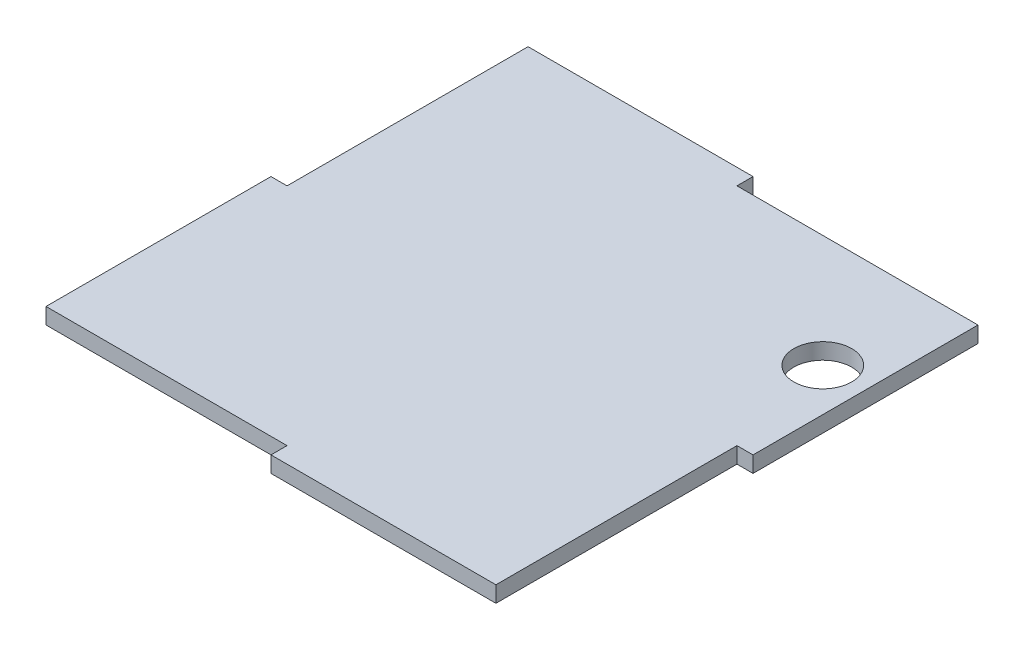
ISO-10303-21;
HEADER;
FILE_DESCRIPTION(('STEP AP214'),'2;1');
FILE_NAME('part.step','',(''),(''),'','','');
FILE_SCHEMA(('AUTOMOTIVE_DESIGN { 1 0 10303 214 1 1 1 1 }'));
ENDSEC;
DATA;
#1=APPLICATION_CONTEXT('core data for automotive mechanical design processes');
#2=APPLICATION_PROTOCOL_DEFINITION('international standard','automotive_design',2000,#1);
#3=PRODUCT_CONTEXT('',#1,'mechanical');
#4=PRODUCT('Part','Part','',(#3));
#5=PRODUCT_RELATED_PRODUCT_CATEGORY('part','',(#4));
#6=PRODUCT_DEFINITION_FORMATION('','',#4);
#7=PRODUCT_DEFINITION_CONTEXT('part definition',#1,'design');
#8=PRODUCT_DEFINITION('design','',#6,#7);
#9=PRODUCT_DEFINITION_SHAPE('','',#8);
#10=(LENGTH_UNIT() NAMED_UNIT(*) SI_UNIT(.MILLI.,.METRE.));
#11=(NAMED_UNIT(*) PLANE_ANGLE_UNIT() SI_UNIT($,.RADIAN.));
#12=(NAMED_UNIT(*) SI_UNIT($,.STERADIAN.) SOLID_ANGLE_UNIT());
#13=UNCERTAINTY_MEASURE_WITH_UNIT(LENGTH_MEASURE(1.E-05),#10,'distance_accuracy_value','');
#14=(GEOMETRIC_REPRESENTATION_CONTEXT(3) GLOBAL_UNCERTAINTY_ASSIGNED_CONTEXT((#13)) GLOBAL_UNIT_ASSIGNED_CONTEXT((#10,
#11,#12)) REPRESENTATION_CONTEXT('',''));
#15=CARTESIAN_POINT('',(0.,0.,0.));
#16=DIRECTION('',(0.,0.,1.));
#17=DIRECTION('',(1.,0.,0.));
#18=AXIS2_PLACEMENT_3D('',#15,#16,#17);
#19=CARTESIAN_POINT('',(0.,6.35,-4.5401216046462));
#20=DIRECTION('',(0.,0.,-1.));
#21=DIRECTION('',(-1.,0.,0.));
#22=AXIS2_PLACEMENT_3D('',#19,#20,#21);
#23=PLANE('',#22);
#24=DIRECTION('',(1.,0.,0.));
#25=VECTOR('',#24,1.);
#26=CARTESIAN_POINT('',(0.,0.,-4.5401216046462));
#27=LINE('',#26,#25);
#28=CARTESIAN_POINT('',(-118.856214689266,0.,-4.54012160464622));
#29=VERTEX_POINT('',#28);
#30=CARTESIAN_POINT('',(-112.506214689266,0.,-4.54012160464622));
#31=VERTEX_POINT('',#30);
#32=EDGE_CURVE('E158',#29,#31,#27,.T.);
#33=ORIENTED_EDGE('',*,*,#32,.F.);
#34=DIRECTION('',(0.,-1.,0.));
#35=VECTOR('',#34,1.);
#36=CARTESIAN_POINT('',(-118.856214689266,6.35,-4.54012160464622));
#37=LINE('',#36,#35);
#38=CARTESIAN_POINT('',(-118.856214689266,6.35,-4.54012160464622));
#39=VERTEX_POINT('',#38);
#40=EDGE_CURVE('E11',#39,#29,#37,.T.);
#41=ORIENTED_EDGE('',*,*,#40,.F.);
#42=DIRECTION('',(1.,0.,0.));
#43=VECTOR('',#42,1.);
#44=CARTESIAN_POINT('',(0.,6.35,-4.5401216046462));
#45=LINE('',#44,#43);
#46=CARTESIAN_POINT('',(-112.506214689266,6.35,-4.54012160464622));
#47=VERTEX_POINT('',#46);
#48=EDGE_CURVE('E231',#39,#47,#45,.T.);
#49=ORIENTED_EDGE('',*,*,#48,.T.);
#50=DIRECTION('',(0.,-1.,0.));
#51=VECTOR('',#50,1.);
#52=CARTESIAN_POINT('',(-112.506214689266,6.35,-4.54012160464622));
#53=LINE('',#52,#51);
#54=EDGE_CURVE('E100',#47,#31,#53,.T.);
#55=ORIENTED_EDGE('',*,*,#54,.T.);
#56=EDGE_LOOP('',(#33,#41,#49,#55));
#57=FACE_BOUND('',#56,.T.);
#58=ADVANCED_FACE('F37',(#57),#23,.T.);
#59=CARTESIAN_POINT('',(-118.856214689266,6.35,0.));
#60=DIRECTION('',(-1.,0.,0.));
#61=DIRECTION('',(0.,0.,1.));
#62=AXIS2_PLACEMENT_3D('',#59,#60,#61);
#63=PLANE('',#62);
#64=DIRECTION('',(0.,0.,-1.));
#65=VECTOR('',#64,1.);
#66=CARTESIAN_POINT('',(-118.856214689266,0.,0.));
#67=LINE('',#66,#65);
#68=CARTESIAN_POINT('',(-118.856214689266,0.,84.3598783953538));
#69=VERTEX_POINT('',#68);
#70=EDGE_CURVE('E161',#69,#29,#67,.T.);
#71=ORIENTED_EDGE('',*,*,#70,.F.);
#72=DIRECTION('',(0.,-1.,0.));
#73=VECTOR('',#72,1.);
#74=CARTESIAN_POINT('',(-118.856214689266,6.35,84.3598783953538));
#75=LINE('',#74,#73);
#76=CARTESIAN_POINT('',(-118.856214689266,6.35,84.3598783953538));
#77=VERTEX_POINT('',#76);
#78=EDGE_CURVE('E46',#77,#69,#75,.T.);
#79=ORIENTED_EDGE('',*,*,#78,.F.);
#80=DIRECTION('',(0.,0.,-1.));
#81=VECTOR('',#80,1.);
#82=CARTESIAN_POINT('',(-118.856214689266,6.35,0.));
#83=LINE('',#82,#81);
#84=EDGE_CURVE('E227',#77,#39,#83,.T.);
#85=ORIENTED_EDGE('',*,*,#84,.T.);
#86=ORIENTED_EDGE('',*,*,#40,.T.);
#87=EDGE_LOOP('',(#71,#79,#85,#86));
#88=FACE_BOUND('',#87,.T.);
#89=ADVANCED_FACE('F215',(#88),#63,.T.);
#90=CARTESIAN_POINT('',(0.,6.35,84.3598783953538));
#91=DIRECTION('',(0.,0.,1.));
#92=DIRECTION('',(1.,0.,0.));
#93=AXIS2_PLACEMENT_3D('',#90,#91,#92);
#94=PLANE('',#93);
#95=DIRECTION('',(-1.,0.,0.));
#96=VECTOR('',#95,1.);
#97=CARTESIAN_POINT('',(0.,0.,84.3598783953538));
#98=LINE('',#97,#96);
#99=CARTESIAN_POINT('',(-23.6062146892655,0.,84.3598783953538));
#100=VERTEX_POINT('',#99);
#101=EDGE_CURVE('E164',#100,#69,#98,.T.);
#102=ORIENTED_EDGE('',*,*,#101,.F.);
#103=DIRECTION('',(0.,-1.,0.));
#104=VECTOR('',#103,1.);
#105=CARTESIAN_POINT('',(-23.6062146892655,6.35,84.3598783953538));
#106=LINE('',#105,#104);
#107=CARTESIAN_POINT('',(-23.6062146892655,6.35,84.3598783953538));
#108=VERTEX_POINT('',#107);
#109=EDGE_CURVE('E204',#108,#100,#106,.T.);
#110=ORIENTED_EDGE('',*,*,#109,.F.);
#111=DIRECTION('',(-1.,0.,0.));
#112=VECTOR('',#111,1.);
#113=CARTESIAN_POINT('',(0.,6.35,84.3598783953538));
#114=LINE('',#113,#112);
#115=EDGE_CURVE('E211',#108,#77,#114,.T.);
#116=ORIENTED_EDGE('',*,*,#115,.T.);
#117=ORIENTED_EDGE('',*,*,#78,.T.);
#118=EDGE_LOOP('',(#102,#110,#116,#117));
#119=FACE_BOUND('',#118,.T.);
#120=ADVANCED_FACE('F209',(#119),#94,.T.);
#121=CARTESIAN_POINT('',(-23.6062146892656,6.35,0.));
#122=DIRECTION('',(-1.,0.,0.));
#123=DIRECTION('',(0.,0.,1.));
#124=AXIS2_PLACEMENT_3D('',#121,#122,#123);
#125=PLANE('',#124);
#126=DIRECTION('',(0.,0.,-1.));
#127=VECTOR('',#126,1.);
#128=CARTESIAN_POINT('',(-23.6062146892656,0.,0.));
#129=LINE('',#128,#127);
#130=CARTESIAN_POINT('',(-23.6062146892655,0.,90.7098783953538));
#131=VERTEX_POINT('',#130);
#132=EDGE_CURVE('E167',#131,#100,#129,.T.);
#133=ORIENTED_EDGE('',*,*,#132,.F.);
#134=DIRECTION('',(0.,-1.,0.));
#135=VECTOR('',#134,1.);
#136=CARTESIAN_POINT('',(-23.6062146892655,6.35,90.7098783953538));
#137=LINE('',#136,#135);
#138=CARTESIAN_POINT('',(-23.6062146892655,6.35,90.7098783953538));
#139=VERTEX_POINT('',#138);
#140=EDGE_CURVE('E202',#139,#131,#137,.T.);
#141=ORIENTED_EDGE('',*,*,#140,.F.);
#142=DIRECTION('',(0.,0.,-1.));
#143=VECTOR('',#142,1.);
#144=CARTESIAN_POINT('',(-23.6062146892656,6.35,0.));
#145=LINE('',#144,#143);
#146=EDGE_CURVE('E224',#139,#108,#145,.T.);
#147=ORIENTED_EDGE('',*,*,#146,.T.);
#148=ORIENTED_EDGE('',*,*,#109,.T.);
#149=EDGE_LOOP('',(#133,#141,#147,#148));
#150=FACE_BOUND('',#149,.T.);
#151=ADVANCED_FACE('F221',(#150),#125,.T.);
#152=CARTESIAN_POINT('',(0.,6.35,90.7098783953538));
#153=DIRECTION('',(0.,0.,1.));
#154=DIRECTION('',(1.,0.,0.));
#155=AXIS2_PLACEMENT_3D('',#152,#153,#154);
#156=PLANE('',#155);
#157=DIRECTION('',(-1.,0.,0.));
#158=VECTOR('',#157,1.);
#159=CARTESIAN_POINT('',(0.,0.,90.7098783953538));
#160=LINE('',#159,#158);
#161=CARTESIAN_POINT('',(65.2937853107345,0.,90.7098783953538));
#162=VERTEX_POINT('',#161);
#163=EDGE_CURVE('E170',#162,#131,#160,.T.);
#164=ORIENTED_EDGE('',*,*,#163,.F.);
#165=DIRECTION('',(0.,-1.,0.));
#166=VECTOR('',#165,1.);
#167=CARTESIAN_POINT('',(65.2937853107345,6.35,90.7098783953538));
#168=LINE('',#167,#166);
#169=CARTESIAN_POINT('',(65.2937853107345,6.35,90.7098783953538));
#170=VERTEX_POINT('',#169);
#171=EDGE_CURVE('E200',#170,#162,#168,.T.);
#172=ORIENTED_EDGE('',*,*,#171,.F.);
#173=DIRECTION('',(-1.,0.,0.));
#174=VECTOR('',#173,1.);
#175=CARTESIAN_POINT('',(0.,6.35,90.7098783953538));
#176=LINE('',#175,#174);
#177=EDGE_CURVE('E229',#170,#139,#176,.T.);
#178=ORIENTED_EDGE('',*,*,#177,.T.);
#179=ORIENTED_EDGE('',*,*,#140,.T.);
#180=EDGE_LOOP('',(#164,#172,#178,#179));
#181=FACE_BOUND('',#180,.T.);
#182=ADVANCED_FACE('F274',(#181),#156,.T.);
#183=CARTESIAN_POINT('',(65.2937853107345,6.35,0.));
#184=DIRECTION('',(1.,0.,0.));
#185=DIRECTION('',(0.,0.,-1.));
#186=AXIS2_PLACEMENT_3D('',#183,#184,#185);
#187=PLANE('',#186);
#188=DIRECTION('',(0.,0.,1.));
#189=VECTOR('',#188,1.);
#190=CARTESIAN_POINT('',(65.2937853107345,0.,0.));
#191=LINE('',#190,#189);
#192=CARTESIAN_POINT('',(65.2937853107345,0.,-4.54012160464622));
#193=VERTEX_POINT('',#192);
#194=EDGE_CURVE('E173',#193,#162,#191,.T.);
#195=ORIENTED_EDGE('',*,*,#194,.F.);
#196=DIRECTION('',(0.,-1.,0.));
#197=VECTOR('',#196,1.);
#198=CARTESIAN_POINT('',(65.2937853107345,6.35,-4.54012160464622));
#199=LINE('',#198,#197);
#200=CARTESIAN_POINT('',(65.2937853107345,6.35,-4.54012160464622));
#201=VERTEX_POINT('',#200);
#202=EDGE_CURVE('E198',#201,#193,#199,.T.);
#203=ORIENTED_EDGE('',*,*,#202,.F.);
#204=DIRECTION('',(0.,0.,1.));
#205=VECTOR('',#204,1.);
#206=CARTESIAN_POINT('',(65.2937853107345,6.35,0.));
#207=LINE('',#206,#205);
#208=EDGE_CURVE('E236',#201,#170,#207,.T.);
#209=ORIENTED_EDGE('',*,*,#208,.T.);
#210=ORIENTED_EDGE('',*,*,#171,.T.);
#211=EDGE_LOOP('',(#195,#203,#209,#210));
#212=FACE_BOUND('',#211,.T.);
#213=ADVANCED_FACE('F277',(#212),#187,.T.);
#214=CARTESIAN_POINT('',(0.,6.35,-4.54012160464621));
#215=DIRECTION('',(0.,0.,1.));
#216=DIRECTION('',(1.,0.,0.));
#217=AXIS2_PLACEMENT_3D('',#214,#215,#216);
#218=PLANE('',#217);
#219=DIRECTION('',(-1.,0.,0.));
#220=VECTOR('',#219,1.);
#221=CARTESIAN_POINT('',(0.,0.,-4.54012160464621));
#222=LINE('',#221,#220);
#223=CARTESIAN_POINT('',(71.6437853107345,0.,-4.54012160464622));
#224=VERTEX_POINT('',#223);
#225=EDGE_CURVE('E176',#224,#193,#222,.T.);
#226=ORIENTED_EDGE('',*,*,#225,.F.);
#227=DIRECTION('',(0.,-1.,0.));
#228=VECTOR('',#227,1.);
#229=CARTESIAN_POINT('',(71.6437853107345,6.35,-4.54012160464622));
#230=LINE('',#229,#228);
#231=CARTESIAN_POINT('',(71.6437853107345,6.35,-4.54012160464622));
#232=VERTEX_POINT('',#231);
#233=EDGE_CURVE('E196',#232,#224,#230,.T.);
#234=ORIENTED_EDGE('',*,*,#233,.F.);
#235=DIRECTION('',(-1.,0.,0.));
#236=VECTOR('',#235,1.);
#237=CARTESIAN_POINT('',(0.,6.35,-4.54012160464621));
#238=LINE('',#237,#236);
#239=EDGE_CURVE('E239',#232,#201,#238,.T.);
#240=ORIENTED_EDGE('',*,*,#239,.T.);
#241=ORIENTED_EDGE('',*,*,#202,.T.);
#242=EDGE_LOOP('',(#226,#234,#240,#241));
#243=FACE_BOUND('',#242,.T.);
#244=ADVANCED_FACE('F281',(#243),#218,.T.);
#245=CARTESIAN_POINT('',(71.6437853107345,6.35,0.));
#246=DIRECTION('',(1.,0.,0.));
#247=DIRECTION('',(0.,0.,-1.));
#248=AXIS2_PLACEMENT_3D('',#245,#246,#247);
#249=PLANE('',#248);
#250=DIRECTION('',(0.,0.,1.));
#251=VECTOR('',#250,1.);
#252=CARTESIAN_POINT('',(71.6437853107345,0.,0.));
#253=LINE('',#252,#251);
#254=CARTESIAN_POINT('',(71.6437853107345,0.,-93.4401216046462));
#255=VERTEX_POINT('',#254);
#256=EDGE_CURVE('E179',#255,#224,#253,.T.);
#257=ORIENTED_EDGE('',*,*,#256,.F.);
#258=DIRECTION('',(0.,-1.,0.));
#259=VECTOR('',#258,1.);
#260=CARTESIAN_POINT('',(71.6437853107345,6.35,-93.4401216046462));
#261=LINE('',#260,#259);
#262=CARTESIAN_POINT('',(71.6437853107345,6.35,-93.4401216046462));
#263=VERTEX_POINT('',#262);
#264=EDGE_CURVE('E194',#263,#255,#261,.T.);
#265=ORIENTED_EDGE('',*,*,#264,.F.);
#266=DIRECTION('',(0.,0.,1.));
#267=VECTOR('',#266,1.);
#268=CARTESIAN_POINT('',(71.6437853107345,6.35,0.));
#269=LINE('',#268,#267);
#270=EDGE_CURVE('E242',#263,#232,#269,.T.);
#271=ORIENTED_EDGE('',*,*,#270,.T.);
#272=ORIENTED_EDGE('',*,*,#233,.T.);
#273=EDGE_LOOP('',(#257,#265,#271,#272));
#274=FACE_BOUND('',#273,.T.);
#275=ADVANCED_FACE('F285',(#274),#249,.T.);
#276=CARTESIAN_POINT('',(0.,6.35,-93.4401216046462));
#277=DIRECTION('',(0.,0.,-1.));
#278=DIRECTION('',(-1.,0.,0.));
#279=AXIS2_PLACEMENT_3D('',#276,#277,#278);
#280=PLANE('',#279);
#281=DIRECTION('',(1.,0.,0.));
#282=VECTOR('',#281,1.);
#283=CARTESIAN_POINT('',(0.,0.,-93.4401216046462));
#284=LINE('',#283,#282);
#285=CARTESIAN_POINT('',(-23.6062146892655,0.,-93.4401216046462));
#286=VERTEX_POINT('',#285);
#287=EDGE_CURVE('E182',#286,#255,#284,.T.);
#288=ORIENTED_EDGE('',*,*,#287,.F.);
#289=DIRECTION('',(0.,-1.,0.));
#290=VECTOR('',#289,1.);
#291=CARTESIAN_POINT('',(-23.6062146892655,6.35,-93.4401216046462));
#292=LINE('',#291,#290);
#293=CARTESIAN_POINT('',(-23.6062146892655,6.35,-93.4401216046462));
#294=VERTEX_POINT('',#293);
#295=EDGE_CURVE('E141',#294,#286,#292,.T.);
#296=ORIENTED_EDGE('',*,*,#295,.F.);
#297=DIRECTION('',(1.,0.,0.));
#298=VECTOR('',#297,1.);
#299=CARTESIAN_POINT('',(0.,6.35,-93.4401216046462));
#300=LINE('',#299,#298);
#301=EDGE_CURVE('E148',#294,#263,#300,.T.);
#302=ORIENTED_EDGE('',*,*,#301,.T.);
#303=ORIENTED_EDGE('',*,*,#264,.T.);
#304=EDGE_LOOP('',(#288,#296,#302,#303));
#305=FACE_BOUND('',#304,.T.);
#306=ADVANCED_FACE('F246',(#305),#280,.T.);
#307=CARTESIAN_POINT('',(-23.6062146892655,6.35,0.));
#308=DIRECTION('',(1.,0.,0.));
#309=DIRECTION('',(0.,0.,-1.));
#310=AXIS2_PLACEMENT_3D('',#307,#308,#309);
#311=PLANE('',#310);
#312=DIRECTION('',(0.,0.,1.));
#313=VECTOR('',#312,1.);
#314=CARTESIAN_POINT('',(-23.6062146892655,0.,0.));
#315=LINE('',#314,#313);
#316=CARTESIAN_POINT('',(-23.6062146892655,0.,-99.7901216046462));
#317=VERTEX_POINT('',#316);
#318=EDGE_CURVE('E136',#317,#286,#315,.T.);
#319=ORIENTED_EDGE('',*,*,#318,.F.);
#320=DIRECTION('',(0.,-1.,0.));
#321=VECTOR('',#320,1.);
#322=CARTESIAN_POINT('',(-23.6062146892655,6.35,-99.7901216046462));
#323=LINE('',#322,#321);
#324=CARTESIAN_POINT('',(-23.6062146892655,6.35,-99.7901216046462));
#325=VERTEX_POINT('',#324);
#326=EDGE_CURVE('E131',#325,#317,#323,.T.);
#327=ORIENTED_EDGE('',*,*,#326,.F.);
#328=DIRECTION('',(0.,0.,1.));
#329=VECTOR('',#328,1.);
#330=CARTESIAN_POINT('',(-23.6062146892655,6.35,0.));
#331=LINE('',#330,#329);
#332=EDGE_CURVE('E134',#325,#294,#331,.T.);
#333=ORIENTED_EDGE('',*,*,#332,.T.);
#334=ORIENTED_EDGE('',*,*,#295,.T.);
#335=EDGE_LOOP('',(#319,#327,#333,#334));
#336=FACE_BOUND('',#335,.T.);
#337=ADVANCED_FACE('F133',(#336),#311,.T.);
#338=CARTESIAN_POINT('',(0.,6.35,-99.7901216046462));
#339=DIRECTION('',(0.,0.,-1.));
#340=DIRECTION('',(-1.,0.,0.));
#341=AXIS2_PLACEMENT_3D('',#338,#339,#340);
#342=PLANE('',#341);
#343=DIRECTION('',(1.,0.,0.));
#344=VECTOR('',#343,1.);
#345=CARTESIAN_POINT('',(0.,0.,-99.7901216046462));
#346=LINE('',#345,#344);
#347=CARTESIAN_POINT('',(-112.506214689266,0.,-99.7901216046462));
#348=VERTEX_POINT('',#347);
#349=EDGE_CURVE('E186',#348,#317,#346,.T.);
#350=ORIENTED_EDGE('',*,*,#349,.F.);
#351=DIRECTION('',(0.,-1.,0.));
#352=VECTOR('',#351,1.);
#353=CARTESIAN_POINT('',(-112.506214689266,6.35,-99.7901216046462));
#354=LINE('',#353,#352);
#355=CARTESIAN_POINT('',(-112.506214689266,6.35,-99.7901216046462));
#356=VERTEX_POINT('',#355);
#357=EDGE_CURVE('E93',#356,#348,#354,.T.);
#358=ORIENTED_EDGE('',*,*,#357,.F.);
#359=DIRECTION('',(1.,0.,0.));
#360=VECTOR('',#359,1.);
#361=CARTESIAN_POINT('',(0.,6.35,-99.7901216046462));
#362=LINE('',#361,#360);
#363=EDGE_CURVE('E145',#356,#325,#362,.T.);
#364=ORIENTED_EDGE('',*,*,#363,.T.);
#365=ORIENTED_EDGE('',*,*,#326,.T.);
#366=EDGE_LOOP('',(#350,#358,#364,#365));
#367=FACE_BOUND('',#366,.T.);
#368=ADVANCED_FACE('F150',(#367),#342,.T.);
#369=CARTESIAN_POINT('',(54.7527853107345,6.35,-48.9901216046462));
#370=DIRECTION('',(0.,-1.,0.));
#371=DIRECTION('',(0.,0.,-1.));
#372=AXIS2_PLACEMENT_3D('',#369,#370,#371);
#373=CYLINDRICAL_SURFACE('',#372,11.43);
#374=CARTESIAN_POINT('',(54.7527853107345,6.35,-48.9901216046462));
#375=DIRECTION('',(0.,1.,0.));
#376=DIRECTION('',(0.,0.,1.));
#377=AXIS2_PLACEMENT_3D('',#374,#375,#376);
#378=CIRCLE('',#377,11.43);
#379=CARTESIAN_POINT('',(54.7527853107345,6.35,-37.5601216046462));
#380=VERTEX_POINT('',#379);
#381=EDGE_CURVE('E190',#380,#380,#378,.T.);
#382=ORIENTED_EDGE('',*,*,#381,.T.);
#383=EDGE_LOOP('',(#382));
#384=FACE_BOUND('',#383,.T.);
#385=CARTESIAN_POINT('',(54.7527853107345,0.,-48.9901216046462));
#386=DIRECTION('',(0.,1.,0.));
#387=DIRECTION('',(0.,0.,1.));
#388=AXIS2_PLACEMENT_3D('',#385,#386,#387);
#389=CIRCLE('',#388,11.43);
#390=CARTESIAN_POINT('',(54.7527853107345,0.,-37.5601216046462));
#391=VERTEX_POINT('',#390);
#392=EDGE_CURVE('E155',#391,#391,#389,.T.);
#393=ORIENTED_EDGE('',*,*,#392,.F.);
#394=EDGE_LOOP('',(#393));
#395=FACE_BOUND('',#394,.T.);
#396=ADVANCED_FACE('F39',(#384,#395),#373,.F.);
#397=CARTESIAN_POINT('',(-112.506214689266,6.35,0.));
#398=DIRECTION('',(1.,0.,0.));
#399=DIRECTION('',(0.,0.,-1.));
#400=AXIS2_PLACEMENT_3D('',#397,#398,#399);
#401=PLANE('',#400);
#402=DIRECTION('',(0.,0.,1.));
#403=VECTOR('',#402,1.);
#404=CARTESIAN_POINT('',(-112.506214689266,0.,0.));
#405=LINE('',#404,#403);
#406=EDGE_CURVE('E188',#348,#31,#405,.T.);
#407=ORIENTED_EDGE('',*,*,#406,.T.);
#408=ORIENTED_EDGE('',*,*,#54,.F.);
#409=DIRECTION('',(0.,0.,1.));
#410=VECTOR('',#409,1.);
#411=CARTESIAN_POINT('',(-112.506214689266,6.35,0.));
#412=LINE('',#411,#410);
#413=EDGE_CURVE('E54',#356,#47,#412,.T.);
#414=ORIENTED_EDGE('',*,*,#413,.F.);
#415=ORIENTED_EDGE('',*,*,#357,.T.);
#416=EDGE_LOOP('',(#407,#408,#414,#415));
#417=FACE_BOUND('',#416,.T.);
#418=ADVANCED_FACE('F248',(#417),#401,.F.);
#419=CARTESIAN_POINT('',(0.,6.35,0.));
#420=DIRECTION('',(0.,1.,0.));
#421=DIRECTION('',(0.,0.,1.));
#422=AXIS2_PLACEMENT_3D('',#419,#420,#421);
#423=PLANE('',#422);
#424=ORIENTED_EDGE('',*,*,#381,.F.);
#425=EDGE_LOOP('',(#424));
#426=FACE_BOUND('',#425,.T.);
#427=ORIENTED_EDGE('',*,*,#48,.F.);
#428=ORIENTED_EDGE('',*,*,#84,.F.);
#429=ORIENTED_EDGE('',*,*,#115,.F.);
#430=ORIENTED_EDGE('',*,*,#146,.F.);
#431=ORIENTED_EDGE('',*,*,#177,.F.);
#432=ORIENTED_EDGE('',*,*,#208,.F.);
#433=ORIENTED_EDGE('',*,*,#239,.F.);
#434=ORIENTED_EDGE('',*,*,#270,.F.);
#435=ORIENTED_EDGE('',*,*,#301,.F.);
#436=ORIENTED_EDGE('',*,*,#332,.F.);
#437=ORIENTED_EDGE('',*,*,#363,.F.);
#438=ORIENTED_EDGE('',*,*,#413,.T.);
#439=EDGE_LOOP('',(#427,#428,#429,#430,#431,#432,#433,#434,#435,#436,#437,#438));
#440=FACE_BOUND('',#439,.T.);
#441=ADVANCED_FACE('F144',(#426,#440),#423,.T.);
#442=CARTESIAN_POINT('',(0.,0.,0.));
#443=DIRECTION('',(0.,1.,0.));
#444=DIRECTION('',(0.,0.,1.));
#445=AXIS2_PLACEMENT_3D('',#442,#443,#444);
#446=PLANE('',#445);
#447=ORIENTED_EDGE('',*,*,#392,.T.);
#448=EDGE_LOOP('',(#447));
#449=FACE_BOUND('',#448,.T.);
#450=ORIENTED_EDGE('',*,*,#32,.T.);
#451=ORIENTED_EDGE('',*,*,#406,.F.);
#452=ORIENTED_EDGE('',*,*,#349,.T.);
#453=ORIENTED_EDGE('',*,*,#318,.T.);
#454=ORIENTED_EDGE('',*,*,#287,.T.);
#455=ORIENTED_EDGE('',*,*,#256,.T.);
#456=ORIENTED_EDGE('',*,*,#225,.T.);
#457=ORIENTED_EDGE('',*,*,#194,.T.);
#458=ORIENTED_EDGE('',*,*,#163,.T.);
#459=ORIENTED_EDGE('',*,*,#132,.T.);
#460=ORIENTED_EDGE('',*,*,#101,.T.);
#461=ORIENTED_EDGE('',*,*,#70,.T.);
#462=EDGE_LOOP('',(#450,#451,#452,#453,#454,#455,#456,#457,#458,#459,#460,#461));
#463=FACE_BOUND('',#462,.T.);
#464=ADVANCED_FACE('F217',(#449,#463),#446,.F.);
#465=CLOSED_SHELL('',(#58,#89,#120,#151,#182,#213,#244,#275,#306,#337,#368,#396,#418,#441,#464));
#466=MANIFOLD_SOLID_BREP('B2',#465);
#467=ADVANCED_BREP_SHAPE_REPRESENTATION('',(#18,#466),#14);
#468=SHAPE_DEFINITION_REPRESENTATION(#9,#467);
ENDSEC;
END-ISO-10303-21;
